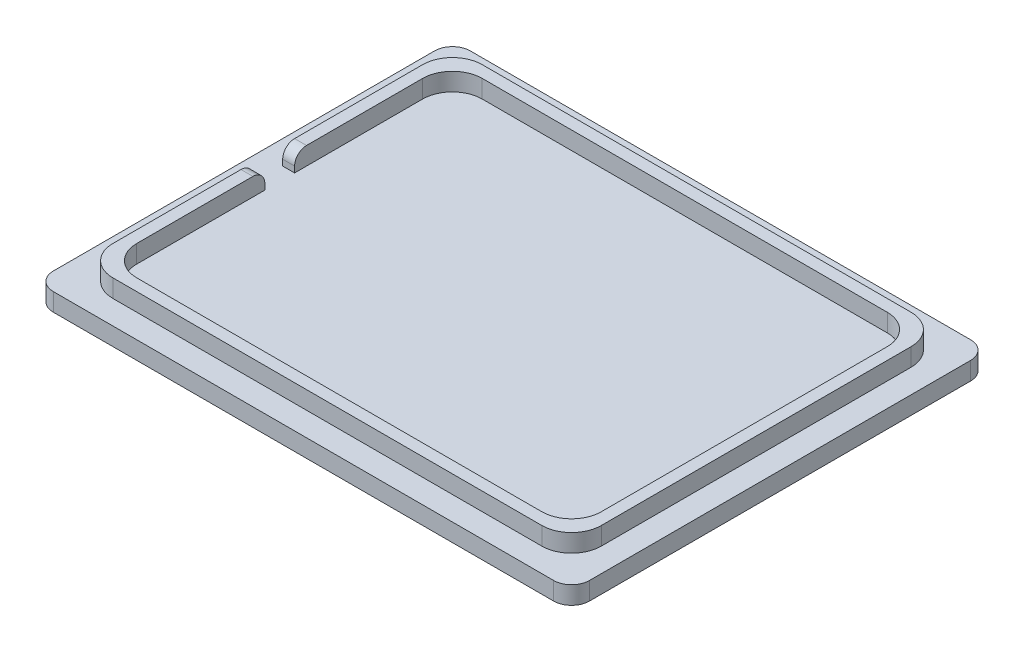
ISO-10303-21;
HEADER;
FILE_DESCRIPTION(('STEP AP214'),'2;1');
FILE_NAME('part.step','',(''),(''),'','','');
FILE_SCHEMA(('AUTOMOTIVE_DESIGN { 1 0 10303 214 1 1 1 1 }'));
ENDSEC;
DATA;
#1=APPLICATION_CONTEXT('core data for automotive mechanical design processes');
#2=APPLICATION_PROTOCOL_DEFINITION('international standard','automotive_design',2000,#1);
#3=PRODUCT_CONTEXT('',#1,'mechanical');
#4=PRODUCT('Part','Part','',(#3));
#5=PRODUCT_RELATED_PRODUCT_CATEGORY('part','',(#4));
#6=PRODUCT_DEFINITION_FORMATION('','',#4);
#7=PRODUCT_DEFINITION_CONTEXT('part definition',#1,'design');
#8=PRODUCT_DEFINITION('design','',#6,#7);
#9=PRODUCT_DEFINITION_SHAPE('','',#8);
#10=(LENGTH_UNIT() NAMED_UNIT(*) SI_UNIT(.MILLI.,.METRE.));
#11=(NAMED_UNIT(*) PLANE_ANGLE_UNIT() SI_UNIT($,.RADIAN.));
#12=(NAMED_UNIT(*) SI_UNIT($,.STERADIAN.) SOLID_ANGLE_UNIT());
#13=UNCERTAINTY_MEASURE_WITH_UNIT(LENGTH_MEASURE(1.E-05),#10,'distance_accuracy_value','');
#14=(GEOMETRIC_REPRESENTATION_CONTEXT(3) GLOBAL_UNCERTAINTY_ASSIGNED_CONTEXT((#13)) GLOBAL_UNIT_ASSIGNED_CONTEXT((#10,
#11,#12)) REPRESENTATION_CONTEXT('',''));
#15=CARTESIAN_POINT('',(0.,0.,0.));
#16=DIRECTION('',(0.,0.,1.));
#17=DIRECTION('',(1.,0.,0.));
#18=AXIS2_PLACEMENT_3D('',#15,#16,#17);
#19=CARTESIAN_POINT('',(-84.,6.,0.));
#20=DIRECTION('',(-1.,0.,0.));
#21=DIRECTION('',(0.,0.,1.));
#22=AXIS2_PLACEMENT_3D('',#19,#20,#21);
#23=PLANE('',#22);
#24=DIRECTION('',(0.,-1.,0.));
#25=VECTOR('',#24,1.);
#26=CARTESIAN_POINT('',(-84.,6.00000000000001,-32.5));
#27=LINE('',#26,#25);
#28=CARTESIAN_POINT('',(-84.,4.,-32.5));
#29=VERTEX_POINT('',#28);
#30=CARTESIAN_POINT('',(-84.,3.,-32.5));
#31=VERTEX_POINT('',#30);
#32=EDGE_CURVE('E246',#29,#31,#27,.T.);
#33=ORIENTED_EDGE('',*,*,#32,.F.);
#34=CARTESIAN_POINT('',(-84.,4.,-30.5));
#35=DIRECTION('',(-1.,0.,0.));
#36=DIRECTION('',(0.,0.,1.));
#37=AXIS2_PLACEMENT_3D('',#34,#35,#36);
#38=CIRCLE('',#37,2.);
#39=CARTESIAN_POINT('',(-84.,6.,-30.5));
#40=VERTEX_POINT('',#39);
#41=EDGE_CURVE('E416',#29,#40,#38,.F.);
#42=ORIENTED_EDGE('',*,*,#41,.T.);
#43=DIRECTION('',(0.,0.,-1.));
#44=VECTOR('',#43,1.);
#45=CARTESIAN_POINT('',(-84.,6.,0.));
#46=LINE('',#45,#44);
#47=CARTESIAN_POINT('',(-84.,6.,-11.));
#48=VERTEX_POINT('',#47);
#49=EDGE_CURVE('E561',#48,#40,#46,.T.);
#50=ORIENTED_EDGE('',*,*,#49,.F.);
#51=DIRECTION('',(0.,-1.,0.));
#52=VECTOR('',#51,1.);
#53=CARTESIAN_POINT('',(-84.,3.,-11.));
#54=LINE('',#53,#52);
#55=CARTESIAN_POINT('',(-84.,3.,-11.));
#56=VERTEX_POINT('',#55);
#57=EDGE_CURVE('E336',#48,#56,#54,.T.);
#58=ORIENTED_EDGE('',*,*,#57,.T.);
#59=DIRECTION('',(0.,0.,1.));
#60=VECTOR('',#59,1.);
#61=CARTESIAN_POINT('',(-84.,3.,0.));
#62=LINE('',#61,#60);
#63=EDGE_CURVE('E254',#31,#56,#62,.T.);
#64=ORIENTED_EDGE('',*,*,#63,.F.);
#65=EDGE_LOOP('',(#33,#42,#50,#58,#64));
#66=FACE_BOUND('',#65,.T.);
#67=ADVANCED_FACE('F33',(#66),#23,.F.);
#68=CARTESIAN_POINT('',(-86.,6.,0.));
#69=DIRECTION('',(-1.,0.,0.));
#70=DIRECTION('',(0.,0.,1.));
#71=AXIS2_PLACEMENT_3D('',#68,#69,#70);
#72=PLANE('',#71);
#73=DIRECTION('',(0.,0.,-1.));
#74=VECTOR('',#73,1.);
#75=CARTESIAN_POINT('',(-86.,6.,0.));
#76=LINE('',#75,#74);
#77=CARTESIAN_POINT('',(-86.,6.,-9.));
#78=VERTEX_POINT('',#77);
#79=CARTESIAN_POINT('',(-86.,6.,-30.5));
#80=VERTEX_POINT('',#79);
#81=EDGE_CURVE('E429',#78,#80,#76,.T.);
#82=ORIENTED_EDGE('',*,*,#81,.T.);
#83=CARTESIAN_POINT('',(-86.,4.,-30.5));
#84=DIRECTION('',(-1.,0.,0.));
#85=DIRECTION('',(0.,0.,1.));
#86=AXIS2_PLACEMENT_3D('',#83,#84,#85);
#87=CIRCLE('',#86,2.);
#88=CARTESIAN_POINT('',(-86.,4.,-32.5));
#89=VERTEX_POINT('',#88);
#90=EDGE_CURVE('E412',#80,#89,#87,.T.);
#91=ORIENTED_EDGE('',*,*,#90,.T.);
#92=DIRECTION('',(0.,1.,0.));
#93=VECTOR('',#92,1.);
#94=CARTESIAN_POINT('',(-86.,6.00000000000001,-32.5));
#95=LINE('',#94,#93);
#96=CARTESIAN_POINT('',(-86.,3.,-32.5));
#97=VERTEX_POINT('',#96);
#98=EDGE_CURVE('E239',#97,#89,#95,.T.);
#99=ORIENTED_EDGE('',*,*,#98,.F.);
#100=DIRECTION('',(0.,0.,1.));
#101=VECTOR('',#100,1.);
#102=CARTESIAN_POINT('',(-86.,3.,0.));
#103=LINE('',#102,#101);
#104=CARTESIAN_POINT('',(-86.,3.,-9.));
#105=VERTEX_POINT('',#104);
#106=EDGE_CURVE('E547',#97,#105,#103,.T.);
#107=ORIENTED_EDGE('',*,*,#106,.T.);
#108=DIRECTION('',(0.,-1.,0.));
#109=VECTOR('',#108,1.);
#110=CARTESIAN_POINT('',(-86.,6.,-9.));
#111=LINE('',#110,#109);
#112=EDGE_CURVE('E359',#105,#78,#111,.F.);
#113=ORIENTED_EDGE('',*,*,#112,.T.);
#114=EDGE_LOOP('',(#82,#91,#99,#107,#113));
#115=FACE_BOUND('',#114,.T.);
#116=ADVANCED_FACE('F439',(#115),#72,.T.);
#117=CARTESIAN_POINT('',(-90.,3.,0.));
#118=DIRECTION('',(-1.,0.,0.));
#119=DIRECTION('',(0.,0.,1.));
#120=AXIS2_PLACEMENT_3D('',#117,#118,#119);
#121=PLANE('',#120);
#122=DIRECTION('',(0.,0.,-1.));
#123=VECTOR('',#122,1.);
#124=CARTESIAN_POINT('',(-90.,0.,0.));
#125=LINE('',#124,#123);
#126=CARTESIAN_POINT('',(-90.,0.,-2.99999999999999));
#127=VERTEX_POINT('',#126);
#128=CARTESIAN_POINT('',(-90.,0.,-67.));
#129=VERTEX_POINT('',#128);
#130=EDGE_CURVE('E274',#127,#129,#125,.T.);
#131=ORIENTED_EDGE('',*,*,#130,.F.);
#132=DIRECTION('',(0.,-1.,0.));
#133=VECTOR('',#132,1.);
#134=CARTESIAN_POINT('',(-90.,3.,-2.99999999999999));
#135=LINE('',#134,#133);
#136=CARTESIAN_POINT('',(-90.,3.,-2.99999999999999));
#137=VERTEX_POINT('',#136);
#138=EDGE_CURVE('E314',#127,#137,#135,.F.);
#139=ORIENTED_EDGE('',*,*,#138,.T.);
#140=DIRECTION('',(0.,0.,-1.));
#141=VECTOR('',#140,1.);
#142=CARTESIAN_POINT('',(-90.,3.,0.));
#143=LINE('',#142,#141);
#144=CARTESIAN_POINT('',(-90.,3.,-67.));
#145=VERTEX_POINT('',#144);
#146=EDGE_CURVE('E275',#137,#145,#143,.T.);
#147=ORIENTED_EDGE('',*,*,#146,.T.);
#148=DIRECTION('',(0.,-1.,0.));
#149=VECTOR('',#148,1.);
#150=CARTESIAN_POINT('',(-90.,0.,-67.));
#151=LINE('',#150,#149);
#152=EDGE_CURVE('E311',#145,#129,#151,.T.);
#153=ORIENTED_EDGE('',*,*,#152,.T.);
#154=EDGE_LOOP('',(#131,#139,#147,#153));
#155=FACE_BOUND('',#154,.T.);
#156=ADVANCED_FACE('F445',(#155),#121,.T.);
#157=CARTESIAN_POINT('',(0.,3.,0.));
#158=DIRECTION('',(0.,0.,1.));
#159=DIRECTION('',(1.,0.,0.));
#160=AXIS2_PLACEMENT_3D('',#157,#158,#159);
#161=PLANE('',#160);
#162=DIRECTION('',(-1.,0.,0.));
#163=VECTOR('',#162,1.);
#164=CARTESIAN_POINT('',(0.,3.,0.));
#165=LINE('',#164,#163);
#166=CARTESIAN_POINT('',(-3.,3.,0.));
#167=VERTEX_POINT('',#166);
#168=CARTESIAN_POINT('',(-87.,3.,0.));
#169=VERTEX_POINT('',#168);
#170=EDGE_CURVE('E278',#167,#169,#165,.T.);
#171=ORIENTED_EDGE('',*,*,#170,.T.);
#172=DIRECTION('',(0.,-1.,0.));
#173=VECTOR('',#172,1.);
#174=CARTESIAN_POINT('',(-87.,3.,0.));
#175=LINE('',#174,#173);
#176=CARTESIAN_POINT('',(-87.,0.,0.));
#177=VERTEX_POINT('',#176);
#178=EDGE_CURVE('E300',#169,#177,#175,.T.);
#179=ORIENTED_EDGE('',*,*,#178,.T.);
#180=DIRECTION('',(-1.,0.,0.));
#181=VECTOR('',#180,1.);
#182=CARTESIAN_POINT('',(0.,0.,0.));
#183=LINE('',#182,#181);
#184=CARTESIAN_POINT('',(-3.,0.,0.));
#185=VERTEX_POINT('',#184);
#186=EDGE_CURVE('E291',#185,#177,#183,.T.);
#187=ORIENTED_EDGE('',*,*,#186,.F.);
#188=DIRECTION('',(0.,-1.,0.));
#189=VECTOR('',#188,1.);
#190=CARTESIAN_POINT('',(-3.,3.,0.));
#191=LINE('',#190,#189);
#192=EDGE_CURVE('E288',#185,#167,#191,.F.);
#193=ORIENTED_EDGE('',*,*,#192,.T.);
#194=EDGE_LOOP('',(#171,#179,#187,#193));
#195=FACE_BOUND('',#194,.T.);
#196=ADVANCED_FACE('F483',(#195),#161,.T.);
#197=CARTESIAN_POINT('',(0.,3.,0.));
#198=DIRECTION('',(-1.,0.,0.));
#199=DIRECTION('',(0.,0.,1.));
#200=AXIS2_PLACEMENT_3D('',#197,#198,#199);
#201=PLANE('',#200);
#202=DIRECTION('',(0.,0.,-1.));
#203=VECTOR('',#202,1.);
#204=CARTESIAN_POINT('',(0.,3.,0.));
#205=LINE('',#204,#203);
#206=CARTESIAN_POINT('',(0.,3.,-3.));
#207=VERTEX_POINT('',#206);
#208=CARTESIAN_POINT('',(0.,3.,-67.));
#209=VERTEX_POINT('',#208);
#210=EDGE_CURVE('E282',#207,#209,#205,.T.);
#211=ORIENTED_EDGE('',*,*,#210,.F.);
#212=DIRECTION('',(0.,-1.,0.));
#213=VECTOR('',#212,1.);
#214=CARTESIAN_POINT('',(0.,0.,-3.));
#215=LINE('',#214,#213);
#216=CARTESIAN_POINT('',(0.,0.,-3.));
#217=VERTEX_POINT('',#216);
#218=EDGE_CURVE('E326',#207,#217,#215,.T.);
#219=ORIENTED_EDGE('',*,*,#218,.T.);
#220=DIRECTION('',(0.,0.,-1.));
#221=VECTOR('',#220,1.);
#222=CARTESIAN_POINT('',(0.,0.,0.));
#223=LINE('',#222,#221);
#224=CARTESIAN_POINT('',(0.,0.,-67.));
#225=VERTEX_POINT('',#224);
#226=EDGE_CURVE('E294',#217,#225,#223,.T.);
#227=ORIENTED_EDGE('',*,*,#226,.T.);
#228=DIRECTION('',(0.,-1.,0.));
#229=VECTOR('',#228,1.);
#230=CARTESIAN_POINT('',(0.,3.,-67.));
#231=LINE('',#230,#229);
#232=EDGE_CURVE('E324',#225,#209,#231,.F.);
#233=ORIENTED_EDGE('',*,*,#232,.T.);
#234=EDGE_LOOP('',(#211,#219,#227,#233));
#235=FACE_BOUND('',#234,.T.);
#236=ADVANCED_FACE('F479',(#235),#201,.F.);
#237=CARTESIAN_POINT('',(0.,3.,-70.));
#238=DIRECTION('',(0.,0.,1.));
#239=DIRECTION('',(1.,0.,0.));
#240=AXIS2_PLACEMENT_3D('',#237,#238,#239);
#241=PLANE('',#240);
#242=DIRECTION('',(-1.,0.,0.));
#243=VECTOR('',#242,1.);
#244=CARTESIAN_POINT('',(0.,3.,-70.));
#245=LINE('',#244,#243);
#246=CARTESIAN_POINT('',(-3.,3.,-70.));
#247=VERTEX_POINT('',#246);
#248=CARTESIAN_POINT('',(-87.,3.,-70.));
#249=VERTEX_POINT('',#248);
#250=EDGE_CURVE('E285',#247,#249,#245,.T.);
#251=ORIENTED_EDGE('',*,*,#250,.F.);
#252=DIRECTION('',(0.,-1.,0.));
#253=VECTOR('',#252,1.);
#254=CARTESIAN_POINT('',(-3.,3.,-70.));
#255=LINE('',#254,#253);
#256=CARTESIAN_POINT('',(-3.,0.,-70.));
#257=VERTEX_POINT('',#256);
#258=EDGE_CURVE('E331',#247,#257,#255,.T.);
#259=ORIENTED_EDGE('',*,*,#258,.T.);
#260=DIRECTION('',(-1.,0.,0.));
#261=VECTOR('',#260,1.);
#262=CARTESIAN_POINT('',(0.,0.,-70.));
#263=LINE('',#262,#261);
#264=CARTESIAN_POINT('',(-87.,0.,-70.));
#265=VERTEX_POINT('',#264);
#266=EDGE_CURVE('E279',#257,#265,#263,.T.);
#267=ORIENTED_EDGE('',*,*,#266,.T.);
#268=DIRECTION('',(0.,-1.,0.));
#269=VECTOR('',#268,1.);
#270=CARTESIAN_POINT('',(-87.,3.,-70.));
#271=LINE('',#270,#269);
#272=EDGE_CURVE('E329',#265,#249,#271,.F.);
#273=ORIENTED_EDGE('',*,*,#272,.T.);
#274=EDGE_LOOP('',(#251,#259,#267,#273));
#275=FACE_BOUND('',#274,.T.);
#276=ADVANCED_FACE('F472',(#275),#241,.F.);
#277=CARTESIAN_POINT('',(0.,3.,0.));
#278=DIRECTION('',(0.,1.,0.));
#279=DIRECTION('',(0.,0.,1.));
#280=AXIS2_PLACEMENT_3D('',#277,#278,#279);
#281=PLANE('',#280);
#282=DIRECTION('',(1.,0.,0.));
#283=VECTOR('',#282,1.);
#284=CARTESIAN_POINT('',(0.,3.,-4.));
#285=LINE('',#284,#283);
#286=CARTESIAN_POINT('',(-81.,3.,-4.));
#287=VERTEX_POINT('',#286);
#288=CARTESIAN_POINT('',(-9.,3.,-4.));
#289=VERTEX_POINT('',#288);
#290=EDGE_CURVE('E271',#287,#289,#285,.T.);
#291=ORIENTED_EDGE('',*,*,#290,.F.);
#292=CARTESIAN_POINT('',(-81.,3.,-9.));
#293=DIRECTION('',(0.,1.,0.));
#294=DIRECTION('',(0.,0.,1.));
#295=AXIS2_PLACEMENT_3D('',#292,#293,#294);
#296=CIRCLE('',#295,5.);
#297=EDGE_CURVE('E392',#287,#105,#296,.F.);
#298=ORIENTED_EDGE('',*,*,#297,.T.);
#299=ORIENTED_EDGE('',*,*,#106,.F.);
#300=DIRECTION('',(-1.,0.,0.));
#301=VECTOR('',#300,1.);
#302=CARTESIAN_POINT('',(0.001000000000001,3.,-32.5));
#303=LINE('',#302,#301);
#304=EDGE_CURVE('E238',#31,#97,#303,.T.);
#305=ORIENTED_EDGE('',*,*,#304,.F.);
#306=ORIENTED_EDGE('',*,*,#63,.T.);
#307=CARTESIAN_POINT('',(-79.,3.,-11.));
#308=DIRECTION('',(0.,1.,0.));
#309=DIRECTION('',(0.,0.,1.));
#310=AXIS2_PLACEMENT_3D('',#307,#308,#309);
#311=CIRCLE('',#310,5.);
#312=CARTESIAN_POINT('',(-79.,3.,-5.99999999999999));
#313=VERTEX_POINT('',#312);
#314=EDGE_CURVE('E344',#56,#313,#311,.T.);
#315=ORIENTED_EDGE('',*,*,#314,.T.);
#316=DIRECTION('',(1.,0.,0.));
#317=VECTOR('',#316,1.);
#318=CARTESIAN_POINT('',(0.,3.,-6.));
#319=LINE('',#318,#317);
#320=CARTESIAN_POINT('',(-11.,3.,-6.));
#321=VERTEX_POINT('',#320);
#322=EDGE_CURVE('E253',#313,#321,#319,.T.);
#323=ORIENTED_EDGE('',*,*,#322,.T.);
#324=CARTESIAN_POINT('',(-11.,3.,-11.));
#325=DIRECTION('',(0.,1.,0.));
#326=DIRECTION('',(0.,0.,1.));
#327=AXIS2_PLACEMENT_3D('',#324,#325,#326);
#328=CIRCLE('',#327,5.);
#329=CARTESIAN_POINT('',(-6.,3.,-11.));
#330=VERTEX_POINT('',#329);
#331=EDGE_CURVE('E342',#321,#330,#328,.T.);
#332=ORIENTED_EDGE('',*,*,#331,.T.);
#333=DIRECTION('',(0.,0.,1.));
#334=VECTOR('',#333,1.);
#335=CARTESIAN_POINT('',(-6.,3.,0.));
#336=LINE('',#335,#334);
#337=CARTESIAN_POINT('',(-6.,3.,-59.));
#338=VERTEX_POINT('',#337);
#339=EDGE_CURVE('E257',#338,#330,#336,.T.);
#340=ORIENTED_EDGE('',*,*,#339,.F.);
#341=CARTESIAN_POINT('',(-11.,3.,-59.));
#342=DIRECTION('',(0.,1.,0.));
#343=DIRECTION('',(0.,0.,1.));
#344=AXIS2_PLACEMENT_3D('',#341,#342,#343);
#345=CIRCLE('',#344,5.);
#346=CARTESIAN_POINT('',(-11.,3.,-64.));
#347=VERTEX_POINT('',#346);
#348=EDGE_CURVE('E340',#338,#347,#345,.T.);
#349=ORIENTED_EDGE('',*,*,#348,.T.);
#350=DIRECTION('',(1.,0.,0.));
#351=VECTOR('',#350,1.);
#352=CARTESIAN_POINT('',(0.,3.,-64.));
#353=LINE('',#352,#351);
#354=CARTESIAN_POINT('',(-79.,3.,-64.));
#355=VERTEX_POINT('',#354);
#356=EDGE_CURVE('E259',#355,#347,#353,.T.);
#357=ORIENTED_EDGE('',*,*,#356,.F.);
#358=CARTESIAN_POINT('',(-79.,3.,-59.));
#359=DIRECTION('',(0.,1.,0.));
#360=DIRECTION('',(0.,0.,1.));
#361=AXIS2_PLACEMENT_3D('',#358,#359,#360);
#362=CIRCLE('',#361,5.);
#363=CARTESIAN_POINT('',(-84.,3.,-59.));
#364=VERTEX_POINT('',#363);
#365=EDGE_CURVE('E252',#355,#364,#362,.T.);
#366=ORIENTED_EDGE('',*,*,#365,.T.);
#367=CARTESIAN_POINT('',(-84.,3.,-37.5));
#368=VERTEX_POINT('',#367);
#369=EDGE_CURVE('E244',#364,#368,#62,.T.);
#370=ORIENTED_EDGE('',*,*,#369,.T.);
#371=DIRECTION('',(-1.,0.,0.));
#372=VECTOR('',#371,1.);
#373=CARTESIAN_POINT('',(0.001000000000001,3.,-37.5));
#374=LINE('',#373,#372);
#375=CARTESIAN_POINT('',(-86.,3.,-37.5));
#376=VERTEX_POINT('',#375);
#377=EDGE_CURVE('E229',#368,#376,#374,.T.);
#378=ORIENTED_EDGE('',*,*,#377,.T.);
#379=CARTESIAN_POINT('',(-86.,3.,-61.));
#380=VERTEX_POINT('',#379);
#381=EDGE_CURVE('E545',#380,#376,#103,.T.);
#382=ORIENTED_EDGE('',*,*,#381,.F.);
#383=CARTESIAN_POINT('',(-81.,3.,-61.));
#384=DIRECTION('',(0.,1.,0.));
#385=DIRECTION('',(0.,0.,1.));
#386=AXIS2_PLACEMENT_3D('',#383,#384,#385);
#387=CIRCLE('',#386,5.);
#388=CARTESIAN_POINT('',(-81.,3.,-66.));
#389=VERTEX_POINT('',#388);
#390=EDGE_CURVE('E405',#380,#389,#387,.F.);
#391=ORIENTED_EDGE('',*,*,#390,.T.);
#392=DIRECTION('',(1.,0.,0.));
#393=VECTOR('',#392,1.);
#394=CARTESIAN_POINT('',(0.,3.,-66.));
#395=LINE('',#394,#393);
#396=CARTESIAN_POINT('',(-9.,3.,-66.));
#397=VERTEX_POINT('',#396);
#398=EDGE_CURVE('E265',#389,#397,#395,.T.);
#399=ORIENTED_EDGE('',*,*,#398,.T.);
#400=CARTESIAN_POINT('',(-9.,3.,-61.));
#401=DIRECTION('',(0.,1.,0.));
#402=DIRECTION('',(0.,0.,1.));
#403=AXIS2_PLACEMENT_3D('',#400,#401,#402);
#404=CIRCLE('',#403,5.);
#405=CARTESIAN_POINT('',(-4.,3.,-61.));
#406=VERTEX_POINT('',#405);
#407=EDGE_CURVE('E401',#397,#406,#404,.F.);
#408=ORIENTED_EDGE('',*,*,#407,.T.);
#409=DIRECTION('',(0.,0.,1.));
#410=VECTOR('',#409,1.);
#411=CARTESIAN_POINT('',(-4.,3.,0.));
#412=LINE('',#411,#410);
#413=CARTESIAN_POINT('',(-4.,3.,-9.));
#414=VERTEX_POINT('',#413);
#415=EDGE_CURVE('E268',#406,#414,#412,.T.);
#416=ORIENTED_EDGE('',*,*,#415,.T.);
#417=CARTESIAN_POINT('',(-9.,3.,-9.));
#418=DIRECTION('',(0.,1.,0.));
#419=DIRECTION('',(0.,0.,1.));
#420=AXIS2_PLACEMENT_3D('',#417,#418,#419);
#421=CIRCLE('',#420,5.);
#422=EDGE_CURVE('E395',#414,#289,#421,.F.);
#423=ORIENTED_EDGE('',*,*,#422,.T.);
#424=EDGE_LOOP('',(#291,#298,#299,#305,#306,#315,#323,#332,#340,#349,#357,#366,#370,#378,#382,
#391,#399,#408,#416,#423));
#425=FACE_BOUND('',#424,.T.);
#426=ORIENTED_EDGE('',*,*,#146,.F.);
#427=CARTESIAN_POINT('',(-87.,3.,-2.99999999999999));
#428=DIRECTION('',(0.,1.,0.));
#429=DIRECTION('',(0.,0.,1.));
#430=AXIS2_PLACEMENT_3D('',#427,#428,#429);
#431=CIRCLE('',#430,3.);
#432=EDGE_CURVE('E322',#137,#169,#431,.T.);
#433=ORIENTED_EDGE('',*,*,#432,.T.);
#434=ORIENTED_EDGE('',*,*,#170,.F.);
#435=CARTESIAN_POINT('',(-3.,3.,-3.));
#436=DIRECTION('',(0.,1.,0.));
#437=DIRECTION('',(0.,0.,1.));
#438=AXIS2_PLACEMENT_3D('',#435,#436,#437);
#439=CIRCLE('',#438,3.);
#440=EDGE_CURVE('E320',#167,#207,#439,.T.);
#441=ORIENTED_EDGE('',*,*,#440,.T.);
#442=ORIENTED_EDGE('',*,*,#210,.T.);
#443=CARTESIAN_POINT('',(-3.,3.,-67.));
#444=DIRECTION('',(0.,1.,0.));
#445=DIRECTION('',(0.,0.,1.));
#446=AXIS2_PLACEMENT_3D('',#443,#444,#445);
#447=CIRCLE('',#446,3.);
#448=EDGE_CURVE('E318',#209,#247,#447,.T.);
#449=ORIENTED_EDGE('',*,*,#448,.T.);
#450=ORIENTED_EDGE('',*,*,#250,.T.);
#451=CARTESIAN_POINT('',(-87.,3.,-67.));
#452=DIRECTION('',(0.,1.,0.));
#453=DIRECTION('',(0.,0.,1.));
#454=AXIS2_PLACEMENT_3D('',#451,#452,#453);
#455=CIRCLE('',#454,3.);
#456=EDGE_CURVE('E316',#249,#145,#455,.T.);
#457=ORIENTED_EDGE('',*,*,#456,.T.);
#458=EDGE_LOOP('',(#426,#433,#434,#441,#442,#449,#450,#457));
#459=FACE_BOUND('',#458,.T.);
#460=ADVANCED_FACE('F249',(#425,#459),#281,.T.);
#461=CARTESIAN_POINT('',(0.,0.,0.));
#462=DIRECTION('',(0.,1.,0.));
#463=DIRECTION('',(0.,0.,1.));
#464=AXIS2_PLACEMENT_3D('',#461,#462,#463);
#465=PLANE('',#464);
#466=ORIENTED_EDGE('',*,*,#186,.T.);
#467=CARTESIAN_POINT('',(-87.,0.,-2.99999999999999));
#468=DIRECTION('',(0.,1.,0.));
#469=DIRECTION('',(0.,0.,1.));
#470=AXIS2_PLACEMENT_3D('',#467,#468,#469);
#471=CIRCLE('',#470,3.);
#472=EDGE_CURVE('E309',#177,#127,#471,.F.);
#473=ORIENTED_EDGE('',*,*,#472,.T.);
#474=ORIENTED_EDGE('',*,*,#130,.T.);
#475=CARTESIAN_POINT('',(-87.,0.,-67.));
#476=DIRECTION('',(0.,1.,0.));
#477=DIRECTION('',(0.,0.,1.));
#478=AXIS2_PLACEMENT_3D('',#475,#476,#477);
#479=CIRCLE('',#478,3.);
#480=EDGE_CURVE('E303',#129,#265,#479,.F.);
#481=ORIENTED_EDGE('',*,*,#480,.T.);
#482=ORIENTED_EDGE('',*,*,#266,.F.);
#483=CARTESIAN_POINT('',(-3.,0.,-67.));
#484=DIRECTION('',(0.,1.,0.));
#485=DIRECTION('',(0.,0.,1.));
#486=AXIS2_PLACEMENT_3D('',#483,#484,#485);
#487=CIRCLE('',#486,3.);
#488=EDGE_CURVE('E305',#257,#225,#487,.F.);
#489=ORIENTED_EDGE('',*,*,#488,.T.);
#490=ORIENTED_EDGE('',*,*,#226,.F.);
#491=CARTESIAN_POINT('',(-3.,0.,-3.));
#492=DIRECTION('',(0.,1.,0.));
#493=DIRECTION('',(0.,0.,1.));
#494=AXIS2_PLACEMENT_3D('',#491,#492,#493);
#495=CIRCLE('',#494,3.);
#496=EDGE_CURVE('E307',#217,#185,#495,.F.);
#497=ORIENTED_EDGE('',*,*,#496,.T.);
#498=EDGE_LOOP('',(#466,#473,#474,#481,#482,#489,#490,#497));
#499=FACE_BOUND('',#498,.T.);
#500=ADVANCED_FACE('F471',(#499),#465,.F.);
#501=CARTESIAN_POINT('',(0.,6.,-4.));
#502=DIRECTION('',(0.,0.,1.));
#503=DIRECTION('',(1.,0.,0.));
#504=AXIS2_PLACEMENT_3D('',#501,#502,#503);
#505=PLANE('',#504);
#506=DIRECTION('',(-1.,0.,0.));
#507=VECTOR('',#506,1.);
#508=CARTESIAN_POINT('',(0.,6.,-4.));
#509=LINE('',#508,#507);
#510=CARTESIAN_POINT('',(-9.,6.,-4.));
#511=VERTEX_POINT('',#510);
#512=CARTESIAN_POINT('',(-81.,6.,-4.));
#513=VERTEX_POINT('',#512);
#514=EDGE_CURVE('E555',#511,#513,#509,.T.);
#515=ORIENTED_EDGE('',*,*,#514,.T.);
#516=DIRECTION('',(0.,-1.,0.));
#517=VECTOR('',#516,1.);
#518=CARTESIAN_POINT('',(-81.,6.,-4.));
#519=LINE('',#518,#517);
#520=EDGE_CURVE('E353',#513,#287,#519,.T.);
#521=ORIENTED_EDGE('',*,*,#520,.T.);
#522=ORIENTED_EDGE('',*,*,#290,.T.);
#523=DIRECTION('',(0.,-1.,0.));
#524=VECTOR('',#523,1.);
#525=CARTESIAN_POINT('',(-9.,6.,-4.));
#526=LINE('',#525,#524);
#527=EDGE_CURVE('E351',#289,#511,#526,.F.);
#528=ORIENTED_EDGE('',*,*,#527,.T.);
#529=EDGE_LOOP('',(#515,#521,#522,#528));
#530=FACE_BOUND('',#529,.T.);
#531=ADVANCED_FACE('F475',(#530),#505,.T.);
#532=CARTESIAN_POINT('',(-4.,6.,0.));
#533=DIRECTION('',(-1.,0.,0.));
#534=DIRECTION('',(0.,0.,1.));
#535=AXIS2_PLACEMENT_3D('',#532,#533,#534);
#536=PLANE('',#535);
#537=DIRECTION('',(0.,0.,-1.));
#538=VECTOR('',#537,1.);
#539=CARTESIAN_POINT('',(-4.,6.,0.));
#540=LINE('',#539,#538);
#541=CARTESIAN_POINT('',(-4.,6.,-9.));
#542=VERTEX_POINT('',#541);
#543=CARTESIAN_POINT('',(-4.,6.,-61.));
#544=VERTEX_POINT('',#543);
#545=EDGE_CURVE('E552',#542,#544,#540,.T.);
#546=ORIENTED_EDGE('',*,*,#545,.F.);
#547=DIRECTION('',(0.,-1.,0.));
#548=VECTOR('',#547,1.);
#549=CARTESIAN_POINT('',(-4.,3.,-9.));
#550=LINE('',#549,#548);
#551=EDGE_CURVE('E372',#542,#414,#550,.T.);
#552=ORIENTED_EDGE('',*,*,#551,.T.);
#553=ORIENTED_EDGE('',*,*,#415,.F.);
#554=DIRECTION('',(0.,-1.,0.));
#555=VECTOR('',#554,1.);
#556=CARTESIAN_POINT('',(-4.,6.,-61.));
#557=LINE('',#556,#555);
#558=EDGE_CURVE('E370',#406,#544,#557,.F.);
#559=ORIENTED_EDGE('',*,*,#558,.T.);
#560=EDGE_LOOP('',(#546,#552,#553,#559));
#561=FACE_BOUND('',#560,.T.);
#562=ADVANCED_FACE('F610',(#561),#536,.F.);
#563=CARTESIAN_POINT('',(0.,6.,-66.));
#564=DIRECTION('',(0.,0.,1.));
#565=DIRECTION('',(1.,0.,0.));
#566=AXIS2_PLACEMENT_3D('',#563,#564,#565);
#567=PLANE('',#566);
#568=DIRECTION('',(-1.,0.,0.));
#569=VECTOR('',#568,1.);
#570=CARTESIAN_POINT('',(0.,6.,-66.));
#571=LINE('',#570,#569);
#572=CARTESIAN_POINT('',(-9.,6.,-66.));
#573=VERTEX_POINT('',#572);
#574=CARTESIAN_POINT('',(-81.,6.,-66.));
#575=VERTEX_POINT('',#574);
#576=EDGE_CURVE('E430',#573,#575,#571,.T.);
#577=ORIENTED_EDGE('',*,*,#576,.F.);
#578=DIRECTION('',(0.,-1.,0.));
#579=VECTOR('',#578,1.);
#580=CARTESIAN_POINT('',(-9.,6.,-66.));
#581=LINE('',#580,#579);
#582=EDGE_CURVE('E387',#573,#397,#581,.T.);
#583=ORIENTED_EDGE('',*,*,#582,.T.);
#584=ORIENTED_EDGE('',*,*,#398,.F.);
#585=DIRECTION('',(0.,-1.,0.));
#586=VECTOR('',#585,1.);
#587=CARTESIAN_POINT('',(-81.,6.,-66.));
#588=LINE('',#587,#586);
#589=EDGE_CURVE('E385',#389,#575,#588,.F.);
#590=ORIENTED_EDGE('',*,*,#589,.T.);
#591=EDGE_LOOP('',(#577,#583,#584,#590));
#592=FACE_BOUND('',#591,.T.);
#593=ADVANCED_FACE('F464',(#592),#567,.F.);
#594=CARTESIAN_POINT('',(-6.,6.,0.));
#595=DIRECTION('',(-1.,0.,0.));
#596=DIRECTION('',(0.,0.,1.));
#597=AXIS2_PLACEMENT_3D('',#594,#595,#596);
#598=PLANE('',#597);
#599=ORIENTED_EDGE('',*,*,#339,.T.);
#600=DIRECTION('',(0.,-1.,0.));
#601=VECTOR('',#600,1.);
#602=CARTESIAN_POINT('',(-6.,6.,-11.));
#603=LINE('',#602,#601);
#604=CARTESIAN_POINT('',(-6.,6.,-11.));
#605=VERTEX_POINT('',#604);
#606=EDGE_CURVE('E378',#330,#605,#603,.F.);
#607=ORIENTED_EDGE('',*,*,#606,.T.);
#608=DIRECTION('',(0.,0.,-1.));
#609=VECTOR('',#608,1.);
#610=CARTESIAN_POINT('',(-6.,6.,0.));
#611=LINE('',#610,#609);
#612=CARTESIAN_POINT('',(-6.,6.,-59.));
#613=VERTEX_POINT('',#612);
#614=EDGE_CURVE('E567',#605,#613,#611,.T.);
#615=ORIENTED_EDGE('',*,*,#614,.T.);
#616=DIRECTION('',(0.,-1.,0.));
#617=VECTOR('',#616,1.);
#618=CARTESIAN_POINT('',(-6.,3.,-59.));
#619=LINE('',#618,#617);
#620=EDGE_CURVE('E375',#613,#338,#619,.T.);
#621=ORIENTED_EDGE('',*,*,#620,.T.);
#622=EDGE_LOOP('',(#599,#607,#615,#621));
#623=FACE_BOUND('',#622,.T.);
#624=ADVANCED_FACE('F459',(#623),#598,.T.);
#625=CARTESIAN_POINT('',(0.,6.,-6.));
#626=DIRECTION('',(0.,0.,1.));
#627=DIRECTION('',(1.,0.,0.));
#628=AXIS2_PLACEMENT_3D('',#625,#626,#627);
#629=PLANE('',#628);
#630=ORIENTED_EDGE('',*,*,#322,.F.);
#631=DIRECTION('',(0.,-1.,0.));
#632=VECTOR('',#631,1.);
#633=CARTESIAN_POINT('',(-79.,6.,-5.99999999999999));
#634=LINE('',#633,#632);
#635=CARTESIAN_POINT('',(-79.,6.,-5.99999999999999));
#636=VERTEX_POINT('',#635);
#637=EDGE_CURVE('E349',#313,#636,#634,.F.);
#638=ORIENTED_EDGE('',*,*,#637,.T.);
#639=DIRECTION('',(-1.,0.,0.));
#640=VECTOR('',#639,1.);
#641=CARTESIAN_POINT('',(0.,6.,-6.));
#642=LINE('',#641,#640);
#643=CARTESIAN_POINT('',(-11.,6.,-6.));
#644=VERTEX_POINT('',#643);
#645=EDGE_CURVE('E564',#644,#636,#642,.T.);
#646=ORIENTED_EDGE('',*,*,#645,.F.);
#647=DIRECTION('',(0.,-1.,0.));
#648=VECTOR('',#647,1.);
#649=CARTESIAN_POINT('',(-11.,6.,-6.));
#650=LINE('',#649,#648);
#651=EDGE_CURVE('E346',#644,#321,#650,.T.);
#652=ORIENTED_EDGE('',*,*,#651,.T.);
#653=EDGE_LOOP('',(#630,#638,#646,#652));
#654=FACE_BOUND('',#653,.T.);
#655=ADVANCED_FACE('F453',(#654),#629,.F.);
#656=CARTESIAN_POINT('',(-84.,6.,-39.5));
#657=VERTEX_POINT('',#656);
#658=CARTESIAN_POINT('',(-84.,6.,-59.));
#659=VERTEX_POINT('',#658);
#660=EDGE_CURVE('E563',#657,#659,#46,.T.);
#661=ORIENTED_EDGE('',*,*,#660,.F.);
#662=CARTESIAN_POINT('',(-84.,4.,-39.5));
#663=DIRECTION('',(-1.,0.,0.));
#664=DIRECTION('',(0.,0.,1.));
#665=AXIS2_PLACEMENT_3D('',#662,#663,#664);
#666=CIRCLE('',#665,2.);
#667=CARTESIAN_POINT('',(-84.,4.,-37.5));
#668=VERTEX_POINT('',#667);
#669=EDGE_CURVE('E11',#657,#668,#666,.F.);
#670=ORIENTED_EDGE('',*,*,#669,.T.);
#671=DIRECTION('',(0.,1.,0.));
#672=VECTOR('',#671,1.);
#673=CARTESIAN_POINT('',(-84.,6.00000000000001,-37.5));
#674=LINE('',#673,#672);
#675=EDGE_CURVE('E231',#368,#668,#674,.T.);
#676=ORIENTED_EDGE('',*,*,#675,.F.);
#677=ORIENTED_EDGE('',*,*,#369,.F.);
#678=DIRECTION('',(0.,-1.,0.));
#679=VECTOR('',#678,1.);
#680=CARTESIAN_POINT('',(-84.,6.,-59.));
#681=LINE('',#680,#679);
#682=EDGE_CURVE('E334',#364,#659,#681,.F.);
#683=ORIENTED_EDGE('',*,*,#682,.T.);
#684=EDGE_LOOP('',(#661,#670,#676,#677,#683));
#685=FACE_BOUND('',#684,.T.);
#686=ADVANCED_FACE('F242',(#685),#23,.F.);
#687=CARTESIAN_POINT('',(0.,6.,-64.));
#688=DIRECTION('',(0.,0.,1.));
#689=DIRECTION('',(1.,0.,0.));
#690=AXIS2_PLACEMENT_3D('',#687,#688,#689);
#691=PLANE('',#690);
#692=ORIENTED_EDGE('',*,*,#356,.T.);
#693=DIRECTION('',(0.,-1.,0.));
#694=VECTOR('',#693,1.);
#695=CARTESIAN_POINT('',(-11.,6.,-64.));
#696=LINE('',#695,#694);
#697=CARTESIAN_POINT('',(-11.,6.,-64.));
#698=VERTEX_POINT('',#697);
#699=EDGE_CURVE('E383',#347,#698,#696,.F.);
#700=ORIENTED_EDGE('',*,*,#699,.T.);
#701=DIRECTION('',(-1.,0.,0.));
#702=VECTOR('',#701,1.);
#703=CARTESIAN_POINT('',(0.,6.,-64.));
#704=LINE('',#703,#702);
#705=CARTESIAN_POINT('',(-79.,6.,-64.));
#706=VERTEX_POINT('',#705);
#707=EDGE_CURVE('E558',#698,#706,#704,.T.);
#708=ORIENTED_EDGE('',*,*,#707,.T.);
#709=DIRECTION('',(0.,-1.,0.));
#710=VECTOR('',#709,1.);
#711=CARTESIAN_POINT('',(-79.,6.,-64.));
#712=LINE('',#711,#710);
#713=EDGE_CURVE('E380',#706,#355,#712,.T.);
#714=ORIENTED_EDGE('',*,*,#713,.T.);
#715=EDGE_LOOP('',(#692,#700,#708,#714));
#716=FACE_BOUND('',#715,.T.);
#717=ADVANCED_FACE('F452',(#716),#691,.T.);
#718=DIRECTION('',(0.,-1.,0.));
#719=VECTOR('',#718,1.);
#720=CARTESIAN_POINT('',(-86.,6.00000000000001,-37.5));
#721=LINE('',#720,#719);
#722=CARTESIAN_POINT('',(-86.,4.,-37.5));
#723=VERTEX_POINT('',#722);
#724=EDGE_CURVE('E233',#723,#376,#721,.T.);
#725=ORIENTED_EDGE('',*,*,#724,.F.);
#726=CARTESIAN_POINT('',(-86.,4.,-39.5));
#727=DIRECTION('',(-1.,0.,0.));
#728=DIRECTION('',(0.,0.,1.));
#729=AXIS2_PLACEMENT_3D('',#726,#727,#728);
#730=CIRCLE('',#729,2.);
#731=CARTESIAN_POINT('',(-86.,6.,-39.5));
#732=VERTEX_POINT('',#731);
#733=EDGE_CURVE('E41',#723,#732,#730,.T.);
#734=ORIENTED_EDGE('',*,*,#733,.T.);
#735=CARTESIAN_POINT('',(-86.,6.,-61.));
#736=VERTEX_POINT('',#735);
#737=EDGE_CURVE('E422',#732,#736,#76,.T.);
#738=ORIENTED_EDGE('',*,*,#737,.T.);
#739=DIRECTION('',(0.,-1.,0.));
#740=VECTOR('',#739,1.);
#741=CARTESIAN_POINT('',(-86.,3.,-61.));
#742=LINE('',#741,#740);
#743=EDGE_CURVE('E356',#736,#380,#742,.T.);
#744=ORIENTED_EDGE('',*,*,#743,.T.);
#745=ORIENTED_EDGE('',*,*,#381,.T.);
#746=EDGE_LOOP('',(#725,#734,#738,#744,#745));
#747=FACE_BOUND('',#746,.T.);
#748=ADVANCED_FACE('F421',(#747),#72,.T.);
#749=CARTESIAN_POINT('',(0.,6.,0.));
#750=DIRECTION('',(0.,1.,0.));
#751=DIRECTION('',(0.,0.,1.));
#752=AXIS2_PLACEMENT_3D('',#749,#750,#751);
#753=PLANE('',#752);
#754=ORIENTED_EDGE('',*,*,#49,.T.);
#755=DIRECTION('',(-1.,0.,0.));
#756=VECTOR('',#755,1.);
#757=CARTESIAN_POINT('',(-86.,6.,-30.5));
#758=LINE('',#757,#756);
#759=EDGE_CURVE('E409',#40,#80,#758,.T.);
#760=ORIENTED_EDGE('',*,*,#759,.T.);
#761=ORIENTED_EDGE('',*,*,#81,.F.);
#762=CARTESIAN_POINT('',(-81.,6.,-9.));
#763=DIRECTION('',(0.,1.,0.));
#764=DIRECTION('',(0.,0.,1.));
#765=AXIS2_PLACEMENT_3D('',#762,#763,#764);
#766=CIRCLE('',#765,5.);
#767=EDGE_CURVE('E368',#78,#513,#766,.T.);
#768=ORIENTED_EDGE('',*,*,#767,.T.);
#769=ORIENTED_EDGE('',*,*,#514,.F.);
#770=CARTESIAN_POINT('',(-9.,6.,-9.));
#771=DIRECTION('',(0.,1.,0.));
#772=DIRECTION('',(0.,0.,1.));
#773=AXIS2_PLACEMENT_3D('',#770,#771,#772);
#774=CIRCLE('',#773,5.);
#775=EDGE_CURVE('E366',#511,#542,#774,.T.);
#776=ORIENTED_EDGE('',*,*,#775,.T.);
#777=ORIENTED_EDGE('',*,*,#545,.T.);
#778=CARTESIAN_POINT('',(-9.,6.,-61.));
#779=DIRECTION('',(0.,1.,0.));
#780=DIRECTION('',(0.,0.,1.));
#781=AXIS2_PLACEMENT_3D('',#778,#779,#780);
#782=CIRCLE('',#781,5.);
#783=EDGE_CURVE('E364',#544,#573,#782,.T.);
#784=ORIENTED_EDGE('',*,*,#783,.T.);
#785=ORIENTED_EDGE('',*,*,#576,.T.);
#786=CARTESIAN_POINT('',(-81.,6.,-61.));
#787=DIRECTION('',(0.,1.,0.));
#788=DIRECTION('',(0.,0.,1.));
#789=AXIS2_PLACEMENT_3D('',#786,#787,#788);
#790=CIRCLE('',#789,5.);
#791=EDGE_CURVE('E361',#575,#736,#790,.T.);
#792=ORIENTED_EDGE('',*,*,#791,.T.);
#793=ORIENTED_EDGE('',*,*,#737,.F.);
#794=DIRECTION('',(-1.,0.,0.));
#795=VECTOR('',#794,1.);
#796=CARTESIAN_POINT('',(-84.,6.,-39.5));
#797=LINE('',#796,#795);
#798=EDGE_CURVE('E407',#732,#657,#797,.F.);
#799=ORIENTED_EDGE('',*,*,#798,.T.);
#800=ORIENTED_EDGE('',*,*,#660,.T.);
#801=CARTESIAN_POINT('',(-79.,6.,-59.));
#802=DIRECTION('',(0.,1.,0.));
#803=DIRECTION('',(0.,0.,1.));
#804=AXIS2_PLACEMENT_3D('',#801,#802,#803);
#805=CIRCLE('',#804,5.);
#806=EDGE_CURVE('E403',#659,#706,#805,.F.);
#807=ORIENTED_EDGE('',*,*,#806,.T.);
#808=ORIENTED_EDGE('',*,*,#707,.F.);
#809=CARTESIAN_POINT('',(-11.,6.,-59.));
#810=DIRECTION('',(0.,1.,0.));
#811=DIRECTION('',(0.,0.,1.));
#812=AXIS2_PLACEMENT_3D('',#809,#810,#811);
#813=CIRCLE('',#812,5.);
#814=EDGE_CURVE('E399',#698,#613,#813,.F.);
#815=ORIENTED_EDGE('',*,*,#814,.T.);
#816=ORIENTED_EDGE('',*,*,#614,.F.);
#817=CARTESIAN_POINT('',(-11.,6.,-11.));
#818=DIRECTION('',(0.,1.,0.));
#819=DIRECTION('',(0.,0.,1.));
#820=AXIS2_PLACEMENT_3D('',#817,#818,#819);
#821=CIRCLE('',#820,5.);
#822=EDGE_CURVE('E397',#605,#644,#821,.F.);
#823=ORIENTED_EDGE('',*,*,#822,.T.);
#824=ORIENTED_EDGE('',*,*,#645,.T.);
#825=CARTESIAN_POINT('',(-79.,6.,-11.));
#826=DIRECTION('',(0.,1.,0.));
#827=DIRECTION('',(0.,0.,1.));
#828=AXIS2_PLACEMENT_3D('',#825,#826,#827);
#829=CIRCLE('',#828,5.);
#830=EDGE_CURVE('E390',#636,#48,#829,.F.);
#831=ORIENTED_EDGE('',*,*,#830,.T.);
#832=EDGE_LOOP('',(#754,#760,#761,#768,#769,#776,#777,#784,#785,#792,#793,#799,#800,#807,#808,
#815,#816,#823,#824,#831));
#833=FACE_BOUND('',#832,.T.);
#834=ADVANCED_FACE('F425',(#833),#753,.T.);
#835=CARTESIAN_POINT('',(-87.,3.,-2.99999999999999));
#836=DIRECTION('',(0.,-1.,0.));
#837=DIRECTION('',(0.,0.,-1.));
#838=AXIS2_PLACEMENT_3D('',#835,#836,#837);
#839=CYLINDRICAL_SURFACE('',#838,3.);
#840=ORIENTED_EDGE('',*,*,#432,.F.);
#841=ORIENTED_EDGE('',*,*,#138,.F.);
#842=ORIENTED_EDGE('',*,*,#472,.F.);
#843=ORIENTED_EDGE('',*,*,#178,.F.);
#844=EDGE_LOOP('',(#840,#841,#842,#843));
#845=FACE_BOUND('',#844,.T.);
#846=ADVANCED_FACE('F491',(#845),#839,.T.);
#847=CARTESIAN_POINT('',(-3.,3.,-3.));
#848=DIRECTION('',(0.,1.,0.));
#849=DIRECTION('',(0.,0.,1.));
#850=AXIS2_PLACEMENT_3D('',#847,#848,#849);
#851=CYLINDRICAL_SURFACE('',#850,3.);
#852=ORIENTED_EDGE('',*,*,#440,.F.);
#853=ORIENTED_EDGE('',*,*,#192,.F.);
#854=ORIENTED_EDGE('',*,*,#496,.F.);
#855=ORIENTED_EDGE('',*,*,#218,.F.);
#856=EDGE_LOOP('',(#852,#853,#854,#855));
#857=FACE_BOUND('',#856,.T.);
#858=ADVANCED_FACE('F494',(#857),#851,.T.);
#859=CARTESIAN_POINT('',(-3.,3.,-67.));
#860=DIRECTION('',(0.,-1.,0.));
#861=DIRECTION('',(0.,0.,-1.));
#862=AXIS2_PLACEMENT_3D('',#859,#860,#861);
#863=CYLINDRICAL_SURFACE('',#862,3.);
#864=ORIENTED_EDGE('',*,*,#448,.F.);
#865=ORIENTED_EDGE('',*,*,#232,.F.);
#866=ORIENTED_EDGE('',*,*,#488,.F.);
#867=ORIENTED_EDGE('',*,*,#258,.F.);
#868=EDGE_LOOP('',(#864,#865,#866,#867));
#869=FACE_BOUND('',#868,.T.);
#870=ADVANCED_FACE('F498',(#869),#863,.T.);
#871=CARTESIAN_POINT('',(-87.,3.,-67.));
#872=DIRECTION('',(0.,1.,0.));
#873=DIRECTION('',(0.,0.,1.));
#874=AXIS2_PLACEMENT_3D('',#871,#872,#873);
#875=CYLINDRICAL_SURFACE('',#874,3.);
#876=ORIENTED_EDGE('',*,*,#456,.F.);
#877=ORIENTED_EDGE('',*,*,#272,.F.);
#878=ORIENTED_EDGE('',*,*,#480,.F.);
#879=ORIENTED_EDGE('',*,*,#152,.F.);
#880=EDGE_LOOP('',(#876,#877,#878,#879));
#881=FACE_BOUND('',#880,.T.);
#882=ADVANCED_FACE('F502',(#881),#875,.T.);
#883=CARTESIAN_POINT('',(-79.,6.,-11.));
#884=DIRECTION('',(0.,1.,0.));
#885=DIRECTION('',(0.,0.,1.));
#886=AXIS2_PLACEMENT_3D('',#883,#884,#885);
#887=CYLINDRICAL_SURFACE('',#886,5.);
#888=ORIENTED_EDGE('',*,*,#830,.F.);
#889=ORIENTED_EDGE('',*,*,#637,.F.);
#890=ORIENTED_EDGE('',*,*,#314,.F.);
#891=ORIENTED_EDGE('',*,*,#57,.F.);
#892=EDGE_LOOP('',(#888,#889,#890,#891));
#893=FACE_BOUND('',#892,.T.);
#894=ADVANCED_FACE('F506',(#893),#887,.F.);
#895=CARTESIAN_POINT('',(-81.,6.,-9.));
#896=DIRECTION('',(0.,-1.,0.));
#897=DIRECTION('',(0.,0.,-1.));
#898=AXIS2_PLACEMENT_3D('',#895,#896,#897);
#899=CYLINDRICAL_SURFACE('',#898,5.);
#900=ORIENTED_EDGE('',*,*,#767,.F.);
#901=ORIENTED_EDGE('',*,*,#112,.F.);
#902=ORIENTED_EDGE('',*,*,#297,.F.);
#903=ORIENTED_EDGE('',*,*,#520,.F.);
#904=EDGE_LOOP('',(#900,#901,#902,#903));
#905=FACE_BOUND('',#904,.T.);
#906=ADVANCED_FACE('F510',(#905),#899,.T.);
#907=CARTESIAN_POINT('',(-9.,6.,-9.));
#908=DIRECTION('',(0.,1.,0.));
#909=DIRECTION('',(0.,0.,1.));
#910=AXIS2_PLACEMENT_3D('',#907,#908,#909);
#911=CYLINDRICAL_SURFACE('',#910,5.);
#912=ORIENTED_EDGE('',*,*,#775,.F.);
#913=ORIENTED_EDGE('',*,*,#527,.F.);
#914=ORIENTED_EDGE('',*,*,#422,.F.);
#915=ORIENTED_EDGE('',*,*,#551,.F.);
#916=EDGE_LOOP('',(#912,#913,#914,#915));
#917=FACE_BOUND('',#916,.T.);
#918=ADVANCED_FACE('F514',(#917),#911,.T.);
#919=CARTESIAN_POINT('',(-11.,6.,-11.));
#920=DIRECTION('',(0.,-1.,0.));
#921=DIRECTION('',(0.,0.,-1.));
#922=AXIS2_PLACEMENT_3D('',#919,#920,#921);
#923=CYLINDRICAL_SURFACE('',#922,5.);
#924=ORIENTED_EDGE('',*,*,#822,.F.);
#925=ORIENTED_EDGE('',*,*,#606,.F.);
#926=ORIENTED_EDGE('',*,*,#331,.F.);
#927=ORIENTED_EDGE('',*,*,#651,.F.);
#928=EDGE_LOOP('',(#924,#925,#926,#927));
#929=FACE_BOUND('',#928,.T.);
#930=ADVANCED_FACE('F518',(#929),#923,.F.);
#931=CARTESIAN_POINT('',(-11.,6.,-59.));
#932=DIRECTION('',(0.,1.,0.));
#933=DIRECTION('',(0.,0.,1.));
#934=AXIS2_PLACEMENT_3D('',#931,#932,#933);
#935=CYLINDRICAL_SURFACE('',#934,5.);
#936=ORIENTED_EDGE('',*,*,#814,.F.);
#937=ORIENTED_EDGE('',*,*,#699,.F.);
#938=ORIENTED_EDGE('',*,*,#348,.F.);
#939=ORIENTED_EDGE('',*,*,#620,.F.);
#940=EDGE_LOOP('',(#936,#937,#938,#939));
#941=FACE_BOUND('',#940,.T.);
#942=ADVANCED_FACE('F522',(#941),#935,.F.);
#943=CARTESIAN_POINT('',(-9.,6.,-61.));
#944=DIRECTION('',(0.,-1.,0.));
#945=DIRECTION('',(0.,0.,-1.));
#946=AXIS2_PLACEMENT_3D('',#943,#944,#945);
#947=CYLINDRICAL_SURFACE('',#946,5.);
#948=ORIENTED_EDGE('',*,*,#783,.F.);
#949=ORIENTED_EDGE('',*,*,#558,.F.);
#950=ORIENTED_EDGE('',*,*,#407,.F.);
#951=ORIENTED_EDGE('',*,*,#582,.F.);
#952=EDGE_LOOP('',(#948,#949,#950,#951));
#953=FACE_BOUND('',#952,.T.);
#954=ADVANCED_FACE('F526',(#953),#947,.T.);
#955=CARTESIAN_POINT('',(-79.,6.,-59.));
#956=DIRECTION('',(0.,-1.,0.));
#957=DIRECTION('',(0.,0.,-1.));
#958=AXIS2_PLACEMENT_3D('',#955,#956,#957);
#959=CYLINDRICAL_SURFACE('',#958,5.);
#960=ORIENTED_EDGE('',*,*,#806,.F.);
#961=ORIENTED_EDGE('',*,*,#682,.F.);
#962=ORIENTED_EDGE('',*,*,#365,.F.);
#963=ORIENTED_EDGE('',*,*,#713,.F.);
#964=EDGE_LOOP('',(#960,#961,#962,#963));
#965=FACE_BOUND('',#964,.T.);
#966=ADVANCED_FACE('F530',(#965),#959,.F.);
#967=CARTESIAN_POINT('',(-81.,6.,-61.));
#968=DIRECTION('',(0.,1.,0.));
#969=DIRECTION('',(0.,0.,1.));
#970=AXIS2_PLACEMENT_3D('',#967,#968,#969);
#971=CYLINDRICAL_SURFACE('',#970,5.);
#972=ORIENTED_EDGE('',*,*,#791,.F.);
#973=ORIENTED_EDGE('',*,*,#589,.F.);
#974=ORIENTED_EDGE('',*,*,#390,.F.);
#975=ORIENTED_EDGE('',*,*,#743,.F.);
#976=EDGE_LOOP('',(#972,#973,#974,#975));
#977=FACE_BOUND('',#976,.T.);
#978=ADVANCED_FACE('F534',(#977),#971,.T.);
#979=CARTESIAN_POINT('',(0.001000000000001,6.00000000000001,-32.5));
#980=DIRECTION('',(0.,0.,1.));
#981=DIRECTION('',(1.,0.,0.));
#982=AXIS2_PLACEMENT_3D('',#979,#980,#981);
#983=PLANE('',#982);
#984=ORIENTED_EDGE('',*,*,#98,.T.);
#985=DIRECTION('',(-1.,0.,0.));
#986=VECTOR('',#985,1.);
#987=CARTESIAN_POINT('',(-84.,4.,-32.5));
#988=LINE('',#987,#986);
#989=EDGE_CURVE('E414',#89,#29,#988,.F.);
#990=ORIENTED_EDGE('',*,*,#989,.T.);
#991=ORIENTED_EDGE('',*,*,#32,.T.);
#992=ORIENTED_EDGE('',*,*,#304,.T.);
#993=EDGE_LOOP('',(#984,#990,#991,#992));
#994=FACE_BOUND('',#993,.T.);
#995=ADVANCED_FACE('F537',(#994),#983,.F.);
#996=CARTESIAN_POINT('',(0.001000000000001,6.00000000000001,-37.5));
#997=DIRECTION('',(0.,0.,-1.));
#998=DIRECTION('',(-1.,0.,0.));
#999=AXIS2_PLACEMENT_3D('',#996,#997,#998);
#1000=PLANE('',#999);
#1001=ORIENTED_EDGE('',*,*,#675,.T.);
#1002=DIRECTION('',(-1.,0.,0.));
#1003=VECTOR('',#1002,1.);
#1004=CARTESIAN_POINT('',(-86.,4.,-37.5));
#1005=LINE('',#1004,#1003);
#1006=EDGE_CURVE('E418',#668,#723,#1005,.T.);
#1007=ORIENTED_EDGE('',*,*,#1006,.T.);
#1008=ORIENTED_EDGE('',*,*,#724,.T.);
#1009=ORIENTED_EDGE('',*,*,#377,.F.);
#1010=EDGE_LOOP('',(#1001,#1007,#1008,#1009));
#1011=FACE_BOUND('',#1010,.T.);
#1012=ADVANCED_FACE('F230',(#1011),#1000,.F.);
#1013=CARTESIAN_POINT('',(0.,4.,-30.5));
#1014=DIRECTION('',(1.,0.,0.));
#1015=DIRECTION('',(0.,0.,-1.));
#1016=AXIS2_PLACEMENT_3D('',#1013,#1014,#1015);
#1017=CYLINDRICAL_SURFACE('',#1016,2.);
#1018=ORIENTED_EDGE('',*,*,#41,.F.);
#1019=ORIENTED_EDGE('',*,*,#989,.F.);
#1020=ORIENTED_EDGE('',*,*,#90,.F.);
#1021=ORIENTED_EDGE('',*,*,#759,.F.);
#1022=EDGE_LOOP('',(#1018,#1019,#1020,#1021));
#1023=FACE_BOUND('',#1022,.T.);
#1024=ADVANCED_FACE('F433',(#1023),#1017,.T.);
#1025=CARTESIAN_POINT('',(0.001000000000001,4.,-39.5));
#1026=DIRECTION('',(1.,0.,0.));
#1027=DIRECTION('',(0.,0.,-1.));
#1028=AXIS2_PLACEMENT_3D('',#1025,#1026,#1027);
#1029=CYLINDRICAL_SURFACE('',#1028,2.);
#1030=ORIENTED_EDGE('',*,*,#669,.F.);
#1031=ORIENTED_EDGE('',*,*,#798,.F.);
#1032=ORIENTED_EDGE('',*,*,#733,.F.);
#1033=ORIENTED_EDGE('',*,*,#1006,.F.);
#1034=EDGE_LOOP('',(#1030,#1031,#1032,#1033));
#1035=FACE_BOUND('',#1034,.T.);
#1036=ADVANCED_FACE('F35',(#1035),#1029,.T.);
#1037=CLOSED_SHELL('',(#67,#116,#156,#196,#236,#276,#460,#500,#531,#562,#593,#624,#655,#686,
#717,#748,#834,#846,#858,#870,#882,#894,#906,#918,#930,#942,#954,#966,#978,#995,#1012,#1024,#1036));
#1038=MANIFOLD_SOLID_BREP('B2',#1037);
#1039=ADVANCED_BREP_SHAPE_REPRESENTATION('',(#18,#1038),#14);
#1040=SHAPE_DEFINITION_REPRESENTATION(#9,#1039);
ENDSEC;
END-ISO-10303-21;
